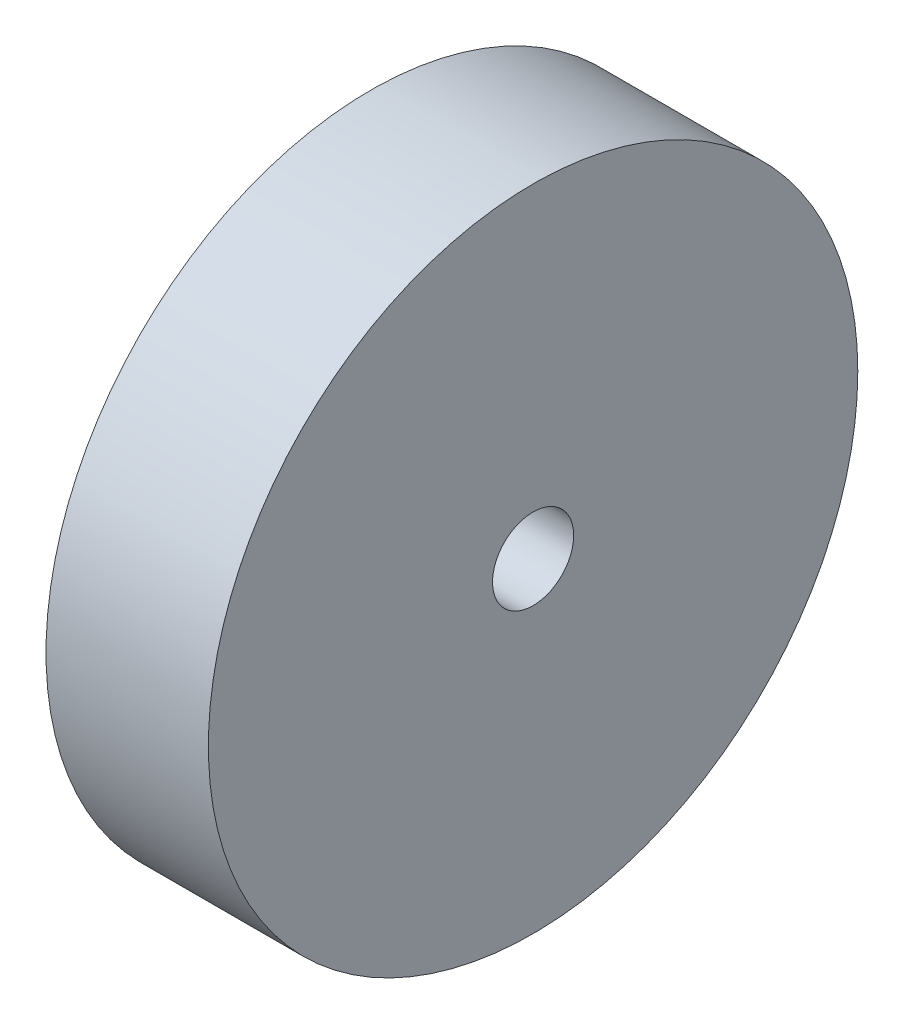
ISO-10303-21;
HEADER;
FILE_DESCRIPTION(('STEP AP214'),'2;1');
FILE_NAME('part.step','',(''),(''),'','','');
FILE_SCHEMA(('AUTOMOTIVE_DESIGN { 1 0 10303 214 1 1 1 1 }'));
ENDSEC;
DATA;
#1=APPLICATION_CONTEXT('core data for automotive mechanical design processes');
#2=APPLICATION_PROTOCOL_DEFINITION('international standard','automotive_design',2000,#1);
#3=PRODUCT_CONTEXT('',#1,'mechanical');
#4=PRODUCT('Part','Part','',(#3));
#5=PRODUCT_RELATED_PRODUCT_CATEGORY('part','',(#4));
#6=PRODUCT_DEFINITION_FORMATION('','',#4);
#7=PRODUCT_DEFINITION_CONTEXT('part definition',#1,'design');
#8=PRODUCT_DEFINITION('design','',#6,#7);
#9=PRODUCT_DEFINITION_SHAPE('','',#8);
#10=(LENGTH_UNIT() NAMED_UNIT(*) SI_UNIT(.MILLI.,.METRE.));
#11=(NAMED_UNIT(*) PLANE_ANGLE_UNIT() SI_UNIT($,.RADIAN.));
#12=(NAMED_UNIT(*) SI_UNIT($,.STERADIAN.) SOLID_ANGLE_UNIT());
#13=UNCERTAINTY_MEASURE_WITH_UNIT(LENGTH_MEASURE(1.E-05),#10,'distance_accuracy_value','');
#14=(GEOMETRIC_REPRESENTATION_CONTEXT(3) GLOBAL_UNCERTAINTY_ASSIGNED_CONTEXT((#13)) GLOBAL_UNIT_ASSIGNED_CONTEXT((#10,
#11,#12)) REPRESENTATION_CONTEXT('',''));
#15=CARTESIAN_POINT('',(0.,0.,0.));
#16=DIRECTION('',(0.,0.,1.));
#17=DIRECTION('',(1.,0.,0.));
#18=AXIS2_PLACEMENT_3D('',#15,#16,#17);
#19=CARTESIAN_POINT('',(12.7,0.,0.));
#20=DIRECTION('',(-1.,0.,0.));
#21=DIRECTION('',(0.,0.,1.));
#22=AXIS2_PLACEMENT_3D('',#19,#20,#21);
#23=CYLINDRICAL_SURFACE('',#22,25.4);
#24=CARTESIAN_POINT('',(12.7,0.,0.));
#25=DIRECTION('',(1.,0.,0.));
#26=DIRECTION('',(0.,0.,-1.));
#27=AXIS2_PLACEMENT_3D('',#24,#25,#26);
#28=CIRCLE('',#27,25.4);
#29=CARTESIAN_POINT('',(12.7,0.,-25.4));
#30=VERTEX_POINT('',#29);
#31=EDGE_CURVE('E10',#30,#30,#28,.T.);
#32=ORIENTED_EDGE('',*,*,#31,.F.);
#33=EDGE_LOOP('',(#32));
#34=FACE_BOUND('',#33,.T.);
#35=CARTESIAN_POINT('',(0.,0.,0.));
#36=DIRECTION('',(1.,0.,0.));
#37=DIRECTION('',(0.,0.,-1.));
#38=AXIS2_PLACEMENT_3D('',#35,#36,#37);
#39=CIRCLE('',#38,25.4);
#40=CARTESIAN_POINT('',(0.,0.,-25.4));
#41=VERTEX_POINT('',#40);
#42=EDGE_CURVE('E46',#41,#41,#39,.T.);
#43=ORIENTED_EDGE('',*,*,#42,.T.);
#44=EDGE_LOOP('',(#43));
#45=FACE_BOUND('',#44,.T.);
#46=ADVANCED_FACE('F43',(#34,#45),#23,.T.);
#47=CARTESIAN_POINT('',(12.7,0.,0.));
#48=DIRECTION('',(1.,0.,0.));
#49=DIRECTION('',(0.,0.,-1.));
#50=AXIS2_PLACEMENT_3D('',#47,#48,#49);
#51=PLANE('',#50);
#52=CARTESIAN_POINT('',(12.7,0.,0.));
#53=DIRECTION('',(1.,0.,0.));
#54=DIRECTION('',(0.,0.,-1.));
#55=AXIS2_PLACEMENT_3D('',#52,#53,#54);
#56=CIRCLE('',#55,3.175);
#57=CARTESIAN_POINT('',(12.7,0.,-3.175));
#58=VERTEX_POINT('',#57);
#59=EDGE_CURVE('E57',#58,#58,#56,.T.);
#60=ORIENTED_EDGE('',*,*,#59,.F.);
#61=EDGE_LOOP('',(#60));
#62=FACE_BOUND('',#61,.T.);
#63=ORIENTED_EDGE('',*,*,#31,.T.);
#64=EDGE_LOOP('',(#63));
#65=FACE_BOUND('',#64,.T.);
#66=ADVANCED_FACE('F74',(#62,#65),#51,.T.);
#67=CARTESIAN_POINT('',(0.,0.,0.));
#68=DIRECTION('',(1.,0.,0.));
#69=DIRECTION('',(0.,0.,-1.));
#70=AXIS2_PLACEMENT_3D('',#67,#68,#69);
#71=PLANE('',#70);
#72=ORIENTED_EDGE('',*,*,#42,.F.);
#73=EDGE_LOOP('',(#72));
#74=FACE_BOUND('',#73,.T.);
#75=ADVANCED_FACE('F70',(#74),#71,.F.);
#76=CARTESIAN_POINT('',(6.35,0.,0.));
#77=DIRECTION('',(1.,0.,0.));
#78=DIRECTION('',(0.,0.,-1.));
#79=AXIS2_PLACEMENT_3D('',#76,#77,#78);
#80=CYLINDRICAL_SURFACE('',#79,3.175);
#81=CARTESIAN_POINT('',(6.35,0.,0.));
#82=DIRECTION('',(1.,0.,0.));
#83=DIRECTION('',(0.,0.,-1.));
#84=AXIS2_PLACEMENT_3D('',#81,#82,#83);
#85=CIRCLE('',#84,3.175);
#86=CARTESIAN_POINT('',(6.35,0.,-3.175));
#87=VERTEX_POINT('',#86);
#88=EDGE_CURVE('E55',#87,#87,#85,.T.);
#89=ORIENTED_EDGE('',*,*,#88,.F.);
#90=EDGE_LOOP('',(#89));
#91=FACE_BOUND('',#90,.T.);
#92=ORIENTED_EDGE('',*,*,#59,.T.);
#93=EDGE_LOOP('',(#92));
#94=FACE_BOUND('',#93,.T.);
#95=ADVANCED_FACE('F67',(#91,#94),#80,.F.);
#96=CARTESIAN_POINT('',(6.35,0.,0.));
#97=DIRECTION('',(1.,0.,0.));
#98=DIRECTION('',(0.,0.,-1.));
#99=AXIS2_PLACEMENT_3D('',#96,#97,#98);
#100=PLANE('',#99);
#101=ORIENTED_EDGE('',*,*,#88,.T.);
#102=EDGE_LOOP('',(#101));
#103=FACE_BOUND('',#102,.T.);
#104=ADVANCED_FACE('F65',(#103),#100,.T.);
#105=CLOSED_SHELL('',(#46,#66,#75,#95,#104));
#106=MANIFOLD_SOLID_BREP('B2',#105);
#107=ADVANCED_BREP_SHAPE_REPRESENTATION('',(#18,#106),#14);
#108=SHAPE_DEFINITION_REPRESENTATION(#9,#107);
ENDSEC;
END-ISO-10303-21;
